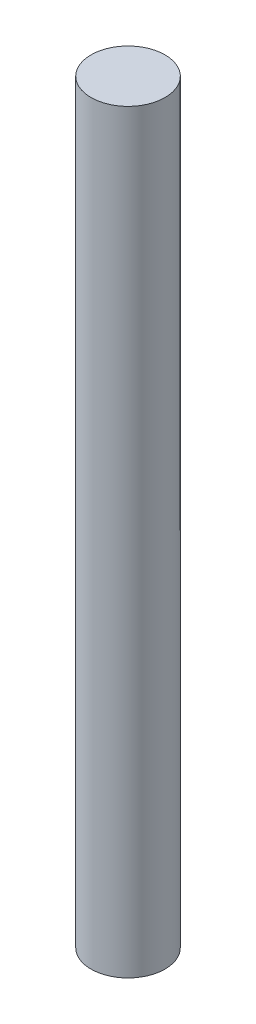
ISO-10303-21;
HEADER;
FILE_DESCRIPTION(('STEP AP214'),'2;1');
FILE_NAME('part.step','',(''),(''),'','','');
FILE_SCHEMA(('AUTOMOTIVE_DESIGN { 1 0 10303 214 1 1 1 1 }'));
ENDSEC;
DATA;
#1=APPLICATION_CONTEXT('core data for automotive mechanical design processes');
#2=APPLICATION_PROTOCOL_DEFINITION('international standard','automotive_design',2000,#1);
#3=PRODUCT_CONTEXT('',#1,'mechanical');
#4=PRODUCT('Part','Part','',(#3));
#5=PRODUCT_RELATED_PRODUCT_CATEGORY('part','',(#4));
#6=PRODUCT_DEFINITION_FORMATION('','',#4);
#7=PRODUCT_DEFINITION_CONTEXT('part definition',#1,'design');
#8=PRODUCT_DEFINITION('design','',#6,#7);
#9=PRODUCT_DEFINITION_SHAPE('','',#8);
#10=(LENGTH_UNIT() NAMED_UNIT(*) SI_UNIT(.MILLI.,.METRE.));
#11=(NAMED_UNIT(*) PLANE_ANGLE_UNIT() SI_UNIT($,.RADIAN.));
#12=(NAMED_UNIT(*) SI_UNIT($,.STERADIAN.) SOLID_ANGLE_UNIT());
#13=UNCERTAINTY_MEASURE_WITH_UNIT(LENGTH_MEASURE(1.E-05),#10,'distance_accuracy_value','');
#14=(GEOMETRIC_REPRESENTATION_CONTEXT(3) GLOBAL_UNCERTAINTY_ASSIGNED_CONTEXT((#13)) GLOBAL_UNIT_ASSIGNED_CONTEXT((#10,
#11,#12)) REPRESENTATION_CONTEXT('',''));
#15=CARTESIAN_POINT('',(0.,0.,0.));
#16=DIRECTION('',(0.,0.,1.));
#17=DIRECTION('',(1.,0.,0.));
#18=AXIS2_PLACEMENT_3D('',#15,#16,#17);
#19=CARTESIAN_POINT('',(0.,17.85,0.));
#20=DIRECTION('',(0.,-1.,0.));
#21=DIRECTION('',(0.,0.,-1.));
#22=AXIS2_PLACEMENT_3D('',#19,#20,#21);
#23=CYLINDRICAL_SURFACE('',#22,1.75);
#24=CARTESIAN_POINT('',(0.,17.85,0.));
#25=DIRECTION('',(0.,1.,0.));
#26=DIRECTION('',(0.,0.,1.));
#27=AXIS2_PLACEMENT_3D('',#24,#25,#26);
#28=CIRCLE('',#27,1.75);
#29=CARTESIAN_POINT('',(0.,17.85,-1.75));
#30=VERTEX_POINT('',#29);
#31=EDGE_CURVE('E10',#30,#30,#28,.T.);
#32=CARTESIAN_POINT('',(0.,-17.85,0.));
#33=DIRECTION('',(0.,1.,0.));
#34=DIRECTION('',(0.,0.,1.));
#35=AXIS2_PLACEMENT_3D('',#32,#33,#34);
#36=CIRCLE('',#35,1.75);
#37=CARTESIAN_POINT('',(0.,-17.85,-1.75));
#38=VERTEX_POINT('',#37);
#39=EDGE_CURVE('E42',#38,#38,#36,.T.);
#40=CARTESIAN_POINT('',(0.,17.85,-1.75));
#41=CARTESIAN_POINT('',(0.,17.478125,-1.75));
#42=CARTESIAN_POINT('',(0.,17.10625,-1.75));
#43=CARTESIAN_POINT('',(0.,16.3625,-1.75));
#44=CARTESIAN_POINT('',(0.,15.990625,-1.75));
#45=CARTESIAN_POINT('',(0.,15.246875,-1.75));
#46=CARTESIAN_POINT('',(0.,14.875,-1.75));
#47=CARTESIAN_POINT('',(0.,14.13125,-1.75));
#48=CARTESIAN_POINT('',(0.,13.759375,-1.75));
#49=CARTESIAN_POINT('',(0.,13.015625,-1.75));
#50=CARTESIAN_POINT('',(0.,12.64375,-1.75));
#51=CARTESIAN_POINT('',(0.,11.9,-1.75));
#52=CARTESIAN_POINT('',(0.,11.528125,-1.75));
#53=CARTESIAN_POINT('',(0.,10.784375,-1.75));
#54=CARTESIAN_POINT('',(0.,10.4125,-1.75));
#55=CARTESIAN_POINT('',(0.,9.66875,-1.75));
#56=CARTESIAN_POINT('',(0.,9.296875,-1.75));
#57=CARTESIAN_POINT('',(0.,8.553125,-1.75));
#58=CARTESIAN_POINT('',(0.,8.18125,-1.75));
#59=CARTESIAN_POINT('',(0.,7.4375,-1.75));
#60=CARTESIAN_POINT('',(0.,7.065625,-1.75));
#61=CARTESIAN_POINT('',(0.,6.321875,-1.75));
#62=CARTESIAN_POINT('',(0.,5.95,-1.75));
#63=CARTESIAN_POINT('',(0.,5.20625,-1.75));
#64=CARTESIAN_POINT('',(0.,4.834375,-1.75));
#65=CARTESIAN_POINT('',(0.,4.090625,-1.75));
#66=CARTESIAN_POINT('',(0.,3.71875,-1.75));
#67=CARTESIAN_POINT('',(0.,2.975,-1.75));
#68=CARTESIAN_POINT('',(0.,2.603125,-1.75));
#69=CARTESIAN_POINT('',(0.,1.859375,-1.75));
#70=CARTESIAN_POINT('',(0.,1.4875,-1.75));
#71=CARTESIAN_POINT('',(0.,0.743750000000001,-1.75));
#72=CARTESIAN_POINT('',(0.,0.371875000000001,-1.75));
#73=CARTESIAN_POINT('',(0.,-0.371875000000001,-1.75));
#74=CARTESIAN_POINT('',(0.,-0.743750000000001,-1.75));
#75=CARTESIAN_POINT('',(0.,-1.4875,-1.75));
#76=CARTESIAN_POINT('',(0.,-1.859375,-1.75));
#77=CARTESIAN_POINT('',(0.,-2.603125,-1.75));
#78=CARTESIAN_POINT('',(0.,-2.975,-1.75));
#79=CARTESIAN_POINT('',(0.,-3.71875,-1.75));
#80=CARTESIAN_POINT('',(0.,-4.090625,-1.75));
#81=CARTESIAN_POINT('',(0.,-4.834375,-1.75));
#82=CARTESIAN_POINT('',(0.,-5.20625,-1.75));
#83=CARTESIAN_POINT('',(0.,-5.95,-1.75));
#84=CARTESIAN_POINT('',(0.,-6.321875,-1.75));
#85=CARTESIAN_POINT('',(0.,-7.065625,-1.75));
#86=CARTESIAN_POINT('',(0.,-7.4375,-1.75));
#87=CARTESIAN_POINT('',(0.,-8.18125,-1.75));
#88=CARTESIAN_POINT('',(0.,-8.553125,-1.75));
#89=CARTESIAN_POINT('',(0.,-9.296875,-1.75));
#90=CARTESIAN_POINT('',(0.,-9.66875,-1.75));
#91=CARTESIAN_POINT('',(0.,-10.4125,-1.75));
#92=CARTESIAN_POINT('',(0.,-10.784375,-1.75));
#93=CARTESIAN_POINT('',(0.,-11.528125,-1.75));
#94=CARTESIAN_POINT('',(0.,-11.9,-1.75));
#95=CARTESIAN_POINT('',(0.,-12.64375,-1.75));
#96=CARTESIAN_POINT('',(0.,-13.015625,-1.75));
#97=CARTESIAN_POINT('',(0.,-13.759375,-1.75));
#98=CARTESIAN_POINT('',(0.,-14.13125,-1.75));
#99=CARTESIAN_POINT('',(0.,-14.875,-1.75));
#100=CARTESIAN_POINT('',(0.,-15.246875,-1.75));
#101=CARTESIAN_POINT('',(0.,-15.990625,-1.75));
#102=CARTESIAN_POINT('',(0.,-16.3625,-1.75));
#103=CARTESIAN_POINT('',(0.,-17.10625,-1.75));
#104=CARTESIAN_POINT('',(0.,-17.478125,-1.75));
#105=CARTESIAN_POINT('',(0.,-17.85,-1.75));
#106=B_SPLINE_CURVE_WITH_KNOTS('',3,(#40,#41,#42,#43,#44,#45,#46,#47,#48,#49,#50,#51,#52,#53,
#54,#55,#56,#57,#58,#59,#60,#61,#62,#63,#64,#65,#66,#67,#68,#69,#70,#71,#72,#73,#74,#75,#76,#77,
#78,#79,#80,#81,#82,#83,#84,#85,#86,#87,#88,#89,#90,#91,#92,#93,#94,#95,#96,#97,#98,#99,#100,
#101,#102,#103,#104,#105),.UNSPECIFIED.,.F.,.F.,(4,2,2,2,2,2,2,2,2,2,2,2,2,2,2,2,2,2,2,2,2,2,2,
2,2,2,2,2,2,2,2,2,4),(0.,1.115625,2.23125,3.346875,4.4625,5.578125,6.69375,7.809375,8.925,
10.040625,11.15625,12.271875,13.3875,14.503125,15.61875,16.734375,17.85,18.965625,20.08125,
21.196875,22.3125,23.428125,24.54375,25.659375,26.775,27.890625,29.00625,30.121875,31.2375,
32.353125,33.46875,34.584375,35.7),.UNSPECIFIED.);
#107=EDGE_CURVE('BSEAM39',#30,#38,#106,.T.);
#108=ORIENTED_EDGE('',*,*,#31,.F.);
#109=ORIENTED_EDGE('',*,*,#39,.T.);
#110=ORIENTED_EDGE('',*,*,#107,.T.);
#111=ORIENTED_EDGE('',*,*,#107,.F.);
#112=EDGE_LOOP('',(#108,#110,#109,#111));
#113=FACE_BOUND('',#112,.T.);
#114=ADVANCED_FACE('F39',(#113),#23,.T.);
#115=CARTESIAN_POINT('',(0.,17.85,0.));
#116=DIRECTION('',(0.,1.,0.));
#117=DIRECTION('',(0.,0.,1.));
#118=AXIS2_PLACEMENT_3D('',#115,#116,#117);
#119=PLANE('',#118);
#120=ORIENTED_EDGE('',*,*,#31,.T.);
#121=EDGE_LOOP('',(#120));
#122=FACE_BOUND('',#121,.T.);
#123=ADVANCED_FACE('F54',(#122),#119,.T.);
#124=CARTESIAN_POINT('',(0.,-17.85,0.));
#125=DIRECTION('',(0.,1.,0.));
#126=DIRECTION('',(0.,0.,1.));
#127=AXIS2_PLACEMENT_3D('',#124,#125,#126);
#128=PLANE('',#127);
#129=ORIENTED_EDGE('',*,*,#39,.F.);
#130=EDGE_LOOP('',(#129));
#131=FACE_BOUND('',#130,.T.);
#132=ADVANCED_FACE('F52',(#131),#128,.F.);
#133=CLOSED_SHELL('',(#114,#123,#132));
#134=MANIFOLD_SOLID_BREP('B2',#133);
#135=ADVANCED_BREP_SHAPE_REPRESENTATION('',(#18,#134),#14);
#136=SHAPE_DEFINITION_REPRESENTATION(#9,#135);
ENDSEC;
END-ISO-10303-21;
